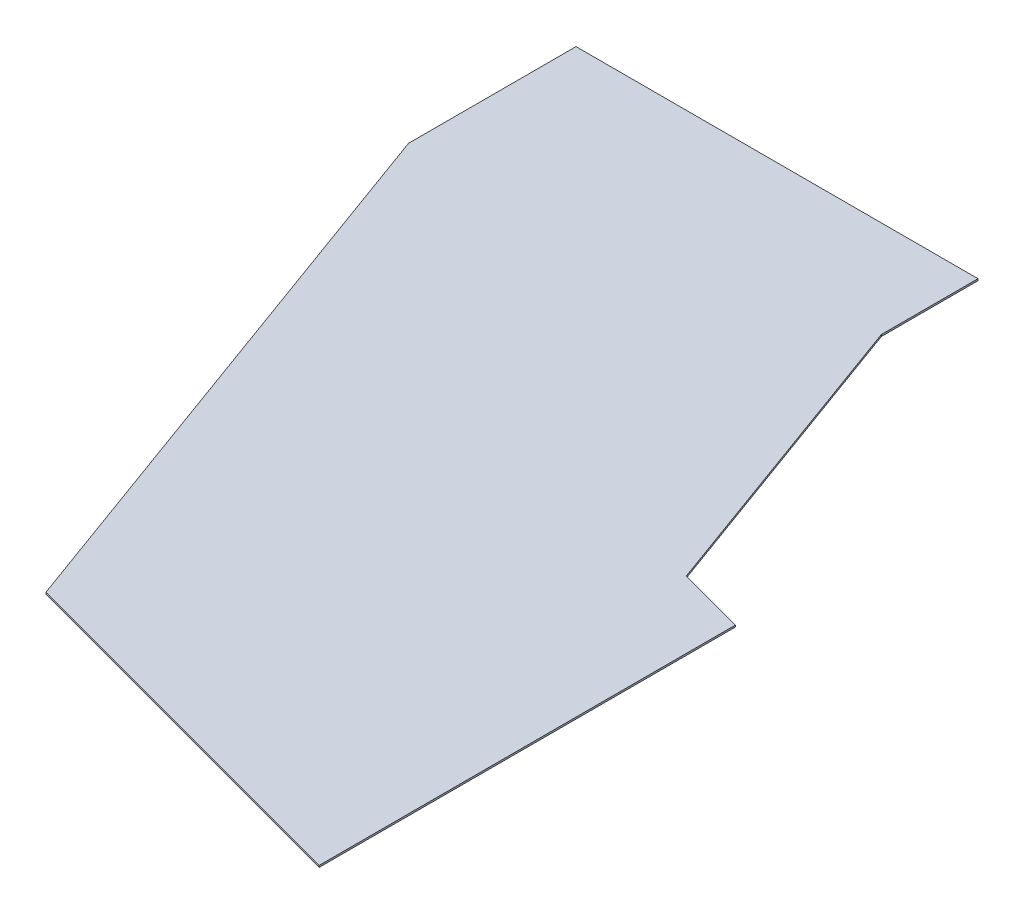
ISO-10303-21;
HEADER;
FILE_DESCRIPTION(('STEP AP214'),'2;1');
FILE_NAME('part.step','',(''),(''),'','','');
FILE_SCHEMA(('AUTOMOTIVE_DESIGN { 1 0 10303 214 1 1 1 1 }'));
ENDSEC;
DATA;
#1=APPLICATION_CONTEXT('core data for automotive mechanical design processes');
#2=APPLICATION_PROTOCOL_DEFINITION('international standard','automotive_design',2000,#1);
#3=PRODUCT_CONTEXT('',#1,'mechanical');
#4=PRODUCT('Part','Part','',(#3));
#5=PRODUCT_RELATED_PRODUCT_CATEGORY('part','',(#4));
#6=PRODUCT_DEFINITION_FORMATION('','',#4);
#7=PRODUCT_DEFINITION_CONTEXT('part definition',#1,'design');
#8=PRODUCT_DEFINITION('design','',#6,#7);
#9=PRODUCT_DEFINITION_SHAPE('','',#8);
#10=(LENGTH_UNIT() NAMED_UNIT(*) SI_UNIT(.MILLI.,.METRE.));
#11=(NAMED_UNIT(*) PLANE_ANGLE_UNIT() SI_UNIT($,.RADIAN.));
#12=(NAMED_UNIT(*) SI_UNIT($,.STERADIAN.) SOLID_ANGLE_UNIT());
#13=UNCERTAINTY_MEASURE_WITH_UNIT(LENGTH_MEASURE(1.E-05),#10,'distance_accuracy_value','');
#14=(GEOMETRIC_REPRESENTATION_CONTEXT(3) GLOBAL_UNCERTAINTY_ASSIGNED_CONTEXT((#13)) GLOBAL_UNIT_ASSIGNED_CONTEXT((#10,
#11,#12)) REPRESENTATION_CONTEXT('',''));
#15=CARTESIAN_POINT('',(0.,0.,0.));
#16=DIRECTION('',(0.,0.,1.));
#17=DIRECTION('',(1.,0.,0.));
#18=AXIS2_PLACEMENT_3D('',#15,#16,#17);
#19=CARTESIAN_POINT('',(0.,-0.8,-117.264755105865));
#20=DIRECTION('',(0.,0.,-1.));
#21=DIRECTION('',(-1.,0.,0.));
#22=AXIS2_PLACEMENT_3D('',#19,#20,#21);
#23=PLANE('',#22);
#24=DIRECTION('',(-1.,0.,0.));
#25=VECTOR('',#24,1.);
#26=CARTESIAN_POINT('',(0.,0.,-117.264755105865));
#27=LINE('',#26,#25);
#28=CARTESIAN_POINT('',(180.,0.,-117.264755105865));
#29=VERTEX_POINT('',#28);
#30=CARTESIAN_POINT('',(0.,0.,-117.264755105865));
#31=VERTEX_POINT('',#30);
#32=EDGE_CURVE('E130',#29,#31,#27,.T.);
#33=ORIENTED_EDGE('',*,*,#32,.F.);
#34=DIRECTION('',(0.,1.,0.));
#35=VECTOR('',#34,1.);
#36=CARTESIAN_POINT('',(180.,-0.8,-117.264755105865));
#37=LINE('',#36,#35);
#38=CARTESIAN_POINT('',(180.,-0.8,-117.264755105865));
#39=VERTEX_POINT('',#38);
#40=EDGE_CURVE('E11',#39,#29,#37,.T.);
#41=ORIENTED_EDGE('',*,*,#40,.F.);
#42=DIRECTION('',(-1.,0.,0.));
#43=VECTOR('',#42,1.);
#44=CARTESIAN_POINT('',(0.,-0.8,-117.264755105865));
#45=LINE('',#44,#43);
#46=CARTESIAN_POINT('',(0.,-0.8,-117.264755105865));
#47=VERTEX_POINT('',#46);
#48=EDGE_CURVE('E150',#39,#47,#45,.T.);
#49=ORIENTED_EDGE('',*,*,#48,.T.);
#50=DIRECTION('',(0.,1.,0.));
#51=VECTOR('',#50,1.);
#52=CARTESIAN_POINT('',(0.,-0.8,-117.264755105865));
#53=LINE('',#52,#51);
#54=EDGE_CURVE('E36',#47,#31,#53,.T.);
#55=ORIENTED_EDGE('',*,*,#54,.T.);
#56=EDGE_LOOP('',(#33,#41,#49,#55));
#57=FACE_BOUND('',#56,.T.);
#58=ADVANCED_FACE('F33',(#57),#23,.T.);
#59=CARTESIAN_POINT('',(180.,-0.8,-117.264755105865));
#60=DIRECTION('',(1.,0.,0.));
#61=DIRECTION('',(0.,0.,-1.));
#62=AXIS2_PLACEMENT_3D('',#59,#60,#61);
#63=PLANE('',#62);
#64=DIRECTION('',(0.,0.,-1.));
#65=VECTOR('',#64,1.);
#66=CARTESIAN_POINT('',(180.,0.,-117.264755105865));
#67=LINE('',#66,#65);
#68=CARTESIAN_POINT('',(180.,0.,-74.0036116333885));
#69=VERTEX_POINT('',#68);
#70=EDGE_CURVE('E148',#69,#29,#67,.T.);
#71=ORIENTED_EDGE('',*,*,#70,.F.);
#72=DIRECTION('',(0.,1.,0.));
#73=VECTOR('',#72,1.);
#74=CARTESIAN_POINT('',(180.,-0.8,-74.0036116333885));
#75=LINE('',#74,#73);
#76=CARTESIAN_POINT('',(180.,-0.8,-74.0036116333885));
#77=VERTEX_POINT('',#76);
#78=EDGE_CURVE('E42',#77,#69,#75,.T.);
#79=ORIENTED_EDGE('',*,*,#78,.F.);
#80=DIRECTION('',(0.,0.,-1.));
#81=VECTOR('',#80,1.);
#82=CARTESIAN_POINT('',(180.,-0.8,-117.264755105865));
#83=LINE('',#82,#81);
#84=EDGE_CURVE('E120',#77,#39,#83,.T.);
#85=ORIENTED_EDGE('',*,*,#84,.T.);
#86=ORIENTED_EDGE('',*,*,#40,.T.);
#87=EDGE_LOOP('',(#71,#79,#85,#86));
#88=FACE_BOUND('',#87,.T.);
#89=ADVANCED_FACE('F162',(#88),#63,.T.);
#90=CARTESIAN_POINT('',(180.,-0.8,-74.0036116333885));
#91=DIRECTION('',(0.939692620785908,0.,-0.34202014332567));
#92=DIRECTION('',(-0.34202014332567,0.,-0.939692620785908));
#93=AXIS2_PLACEMENT_3D('',#90,#91,#92);
#94=PLANE('',#93);
#95=DIRECTION('',(-0.34202014332567,0.,-0.939692620785908));
#96=VECTOR('',#95,1.);
#97=CARTESIAN_POINT('',(180.,0.,-74.0036116333885));
#98=LINE('',#97,#96);
#99=CARTESIAN_POINT('',(229.990642295699,0.,63.3445492580764));
#100=VERTEX_POINT('',#99);
#101=EDGE_CURVE('E107',#100,#69,#98,.T.);
#102=ORIENTED_EDGE('',*,*,#101,.F.);
#103=DIRECTION('',(0.,1.,0.));
#104=VECTOR('',#103,1.);
#105=CARTESIAN_POINT('',(229.990642295699,-0.8,63.3445492580764));
#106=LINE('',#105,#104);
#107=CARTESIAN_POINT('',(229.990642295699,-0.8,63.3445492580764));
#108=VERTEX_POINT('',#107);
#109=EDGE_CURVE('E102',#108,#100,#106,.T.);
#110=ORIENTED_EDGE('',*,*,#109,.F.);
#111=DIRECTION('',(-0.34202014332567,0.,-0.939692620785908));
#112=VECTOR('',#111,1.);
#113=CARTESIAN_POINT('',(180.,-0.8,-74.0036116333885));
#114=LINE('',#113,#112);
#115=EDGE_CURVE('E105',#108,#77,#114,.T.);
#116=ORIENTED_EDGE('',*,*,#115,.T.);
#117=ORIENTED_EDGE('',*,*,#78,.T.);
#118=EDGE_LOOP('',(#102,#110,#116,#117));
#119=FACE_BOUND('',#118,.T.);
#120=ADVANCED_FACE('F104',(#119),#94,.T.);
#121=CARTESIAN_POINT('',(229.990642295699,-0.8,63.3445492580764));
#122=DIRECTION('',(0.258819045102517,0.,-0.965925826289069));
#123=DIRECTION('',(-0.965925826289069,0.,-0.258819045102517));
#124=AXIS2_PLACEMENT_3D('',#121,#122,#123);
#125=PLANE('',#124);
#126=DIRECTION('',(-0.965925826289069,0.,-0.258819045102517));
#127=VECTOR('',#126,1.);
#128=CARTESIAN_POINT('',(229.990642295699,0.,63.3445492580764));
#129=LINE('',#128,#127);
#130=CARTESIAN_POINT('',(260.,0.,71.3855324203206));
#131=VERTEX_POINT('',#130);
#132=EDGE_CURVE('E145',#131,#100,#129,.T.);
#133=ORIENTED_EDGE('',*,*,#132,.F.);
#134=DIRECTION('',(0.,1.,0.));
#135=VECTOR('',#134,1.);
#136=CARTESIAN_POINT('',(260.,-0.8,71.3855324203206));
#137=LINE('',#136,#135);
#138=CARTESIAN_POINT('',(260.,-0.8,71.3855324203206));
#139=VERTEX_POINT('',#138);
#140=EDGE_CURVE('E112',#139,#131,#137,.T.);
#141=ORIENTED_EDGE('',*,*,#140,.F.);
#142=DIRECTION('',(-0.965925826289069,0.,-0.258819045102517));
#143=VECTOR('',#142,1.);
#144=CARTESIAN_POINT('',(229.990642295699,-0.8,63.3445492580764));
#145=LINE('',#144,#143);
#146=EDGE_CURVE('E118',#139,#108,#145,.T.);
#147=ORIENTED_EDGE('',*,*,#146,.T.);
#148=ORIENTED_EDGE('',*,*,#109,.T.);
#149=EDGE_LOOP('',(#133,#141,#147,#148));
#150=FACE_BOUND('',#149,.T.);
#151=ADVANCED_FACE('F122',(#150),#125,.T.);
#152=CARTESIAN_POINT('',(260.,-0.8,257.735244894135));
#153=DIRECTION('',(1.,0.,0.));
#154=DIRECTION('',(0.,0.,-1.));
#155=AXIS2_PLACEMENT_3D('',#152,#153,#154);
#156=PLANE('',#155);
#157=DIRECTION('',(0.,0.,-1.));
#158=VECTOR('',#157,1.);
#159=CARTESIAN_POINT('',(260.,0.,257.735244894135));
#160=LINE('',#159,#158);
#161=CARTESIAN_POINT('',(260.,0.,257.735244894135));
#162=VERTEX_POINT('',#161);
#163=EDGE_CURVE('E142',#162,#131,#160,.T.);
#164=ORIENTED_EDGE('',*,*,#163,.F.);
#165=DIRECTION('',(0.,1.,0.));
#166=VECTOR('',#165,1.);
#167=CARTESIAN_POINT('',(260.,-0.8,257.735244894135));
#168=LINE('',#167,#166);
#169=CARTESIAN_POINT('',(260.,-0.8,257.735244894135));
#170=VERTEX_POINT('',#169);
#171=EDGE_CURVE('E154',#170,#162,#168,.T.);
#172=ORIENTED_EDGE('',*,*,#171,.F.);
#173=DIRECTION('',(0.,0.,-1.));
#174=VECTOR('',#173,1.);
#175=CARTESIAN_POINT('',(260.,-0.8,257.735244894135));
#176=LINE('',#175,#174);
#177=EDGE_CURVE('E123',#170,#139,#176,.T.);
#178=ORIENTED_EDGE('',*,*,#177,.T.);
#179=ORIENTED_EDGE('',*,*,#140,.T.);
#180=EDGE_LOOP('',(#164,#172,#178,#179));
#181=FACE_BOUND('',#180,.T.);
#182=ADVANCED_FACE('F175',(#181),#156,.T.);
#183=CARTESIAN_POINT('',(92.8939656574949,-0.8,212.959317941694));
#184=DIRECTION('',(-0.258819045102517,0.,0.965925826289069));
#185=DIRECTION('',(0.96592582628907,0.,0.258819045102517));
#186=AXIS2_PLACEMENT_3D('',#183,#184,#185);
#187=PLANE('',#186);
#188=DIRECTION('',(0.96592582628907,0.,0.258819045102517));
#189=VECTOR('',#188,1.);
#190=CARTESIAN_POINT('',(92.8939656574949,0.,212.959317941694));
#191=LINE('',#190,#189);
#192=CARTESIAN_POINT('',(92.8939656574949,0.,212.959317941694));
#193=VERTEX_POINT('',#192);
#194=EDGE_CURVE('E139',#193,#162,#191,.T.);
#195=ORIENTED_EDGE('',*,*,#194,.F.);
#196=DIRECTION('',(0.,1.,0.));
#197=VECTOR('',#196,1.);
#198=CARTESIAN_POINT('',(92.8939656574949,-0.8,212.959317941694));
#199=LINE('',#198,#197);
#200=CARTESIAN_POINT('',(92.8939656574949,-0.8,212.959317941694));
#201=VERTEX_POINT('',#200);
#202=EDGE_CURVE('E156',#201,#193,#199,.T.);
#203=ORIENTED_EDGE('',*,*,#202,.F.);
#204=DIRECTION('',(0.96592582628907,0.,0.258819045102517));
#205=VECTOR('',#204,1.);
#206=CARTESIAN_POINT('',(92.8939656574949,-0.8,212.959317941694));
#207=LINE('',#206,#205);
#208=EDGE_CURVE('E125',#201,#170,#207,.T.);
#209=ORIENTED_EDGE('',*,*,#208,.T.);
#210=ORIENTED_EDGE('',*,*,#171,.T.);
#211=EDGE_LOOP('',(#195,#203,#209,#210));
#212=FACE_BOUND('',#211,.T.);
#213=ADVANCED_FACE('F178',(#212),#187,.T.);
#214=CARTESIAN_POINT('',(0.,-0.8,-42.2647551058647));
#215=DIRECTION('',(-0.939692620785908,0.,0.34202014332567));
#216=DIRECTION('',(0.34202014332567,0.,0.939692620785908));
#217=AXIS2_PLACEMENT_3D('',#214,#215,#216);
#218=PLANE('',#217);
#219=DIRECTION('',(0.34202014332567,0.,0.939692620785908));
#220=VECTOR('',#219,1.);
#221=CARTESIAN_POINT('',(0.,0.,-42.2647551058647));
#222=LINE('',#221,#220);
#223=CARTESIAN_POINT('',(0.,0.,-42.2647551058647));
#224=VERTEX_POINT('',#223);
#225=EDGE_CURVE('E136',#224,#193,#222,.T.);
#226=ORIENTED_EDGE('',*,*,#225,.F.);
#227=DIRECTION('',(0.,1.,0.));
#228=VECTOR('',#227,1.);
#229=CARTESIAN_POINT('',(0.,-0.8,-42.2647551058647));
#230=LINE('',#229,#228);
#231=CARTESIAN_POINT('',(0.,-0.8,-42.2647551058647));
#232=VERTEX_POINT('',#231);
#233=EDGE_CURVE('E157',#232,#224,#230,.T.);
#234=ORIENTED_EDGE('',*,*,#233,.F.);
#235=DIRECTION('',(0.34202014332567,0.,0.939692620785908));
#236=VECTOR('',#235,1.);
#237=CARTESIAN_POINT('',(0.,-0.8,-42.2647551058647));
#238=LINE('',#237,#236);
#239=EDGE_CURVE('E273',#232,#201,#238,.T.);
#240=ORIENTED_EDGE('',*,*,#239,.T.);
#241=ORIENTED_EDGE('',*,*,#202,.T.);
#242=EDGE_LOOP('',(#226,#234,#240,#241));
#243=FACE_BOUND('',#242,.T.);
#244=ADVANCED_FACE('F182',(#243),#218,.T.);
#245=CARTESIAN_POINT('',(0.,-0.8,-117.264755105865));
#246=DIRECTION('',(-1.,0.,0.));
#247=DIRECTION('',(0.,0.,1.));
#248=AXIS2_PLACEMENT_3D('',#245,#246,#247);
#249=PLANE('',#248);
#250=DIRECTION('',(0.,0.,1.));
#251=VECTOR('',#250,1.);
#252=CARTESIAN_POINT('',(0.,0.,-117.264755105865));
#253=LINE('',#252,#251);
#254=EDGE_CURVE('E133',#31,#224,#253,.T.);
#255=ORIENTED_EDGE('',*,*,#254,.F.);
#256=ORIENTED_EDGE('',*,*,#54,.F.);
#257=DIRECTION('',(0.,0.,1.));
#258=VECTOR('',#257,1.);
#259=CARTESIAN_POINT('',(0.,-0.8,-117.264755105865));
#260=LINE('',#259,#258);
#261=EDGE_CURVE('E274',#47,#232,#260,.T.);
#262=ORIENTED_EDGE('',*,*,#261,.T.);
#263=ORIENTED_EDGE('',*,*,#233,.T.);
#264=EDGE_LOOP('',(#255,#256,#262,#263));
#265=FACE_BOUND('',#264,.T.);
#266=ADVANCED_FACE('F159',(#265),#249,.T.);
#267=CARTESIAN_POINT('',(180.,-0.8,-117.264755105865));
#268=DIRECTION('',(0.,-1.,0.));
#269=DIRECTION('',(0.,0.,-1.));
#270=AXIS2_PLACEMENT_3D('',#267,#268,#269);
#271=PLANE('',#270);
#272=ORIENTED_EDGE('',*,*,#48,.F.);
#273=ORIENTED_EDGE('',*,*,#84,.F.);
#274=ORIENTED_EDGE('',*,*,#115,.F.);
#275=ORIENTED_EDGE('',*,*,#146,.F.);
#276=ORIENTED_EDGE('',*,*,#177,.F.);
#277=ORIENTED_EDGE('',*,*,#208,.F.);
#278=ORIENTED_EDGE('',*,*,#239,.F.);
#279=ORIENTED_EDGE('',*,*,#261,.F.);
#280=EDGE_LOOP('',(#272,#273,#274,#275,#276,#277,#278,#279));
#281=FACE_BOUND('',#280,.T.);
#282=ADVANCED_FACE('F116',(#281),#271,.T.);
#283=CARTESIAN_POINT('',(180.,0.,-117.264755105865));
#284=DIRECTION('',(0.,-1.,0.));
#285=DIRECTION('',(0.,0.,-1.));
#286=AXIS2_PLACEMENT_3D('',#283,#284,#285);
#287=PLANE('',#286);
#288=ORIENTED_EDGE('',*,*,#32,.T.);
#289=ORIENTED_EDGE('',*,*,#254,.T.);
#290=ORIENTED_EDGE('',*,*,#225,.T.);
#291=ORIENTED_EDGE('',*,*,#194,.T.);
#292=ORIENTED_EDGE('',*,*,#163,.T.);
#293=ORIENTED_EDGE('',*,*,#132,.T.);
#294=ORIENTED_EDGE('',*,*,#101,.T.);
#295=ORIENTED_EDGE('',*,*,#70,.T.);
#296=EDGE_LOOP('',(#288,#289,#290,#291,#292,#293,#294,#295));
#297=FACE_BOUND('',#296,.T.);
#298=ADVANCED_FACE('F161',(#297),#287,.F.);
#299=CLOSED_SHELL('',(#58,#89,#120,#151,#182,#213,#244,#266,#282,#298));
#300=MANIFOLD_SOLID_BREP('B2',#299);
#301=ADVANCED_BREP_SHAPE_REPRESENTATION('',(#18,#300),#14);
#302=SHAPE_DEFINITION_REPRESENTATION(#9,#301);
ENDSEC;
END-ISO-10303-21;
